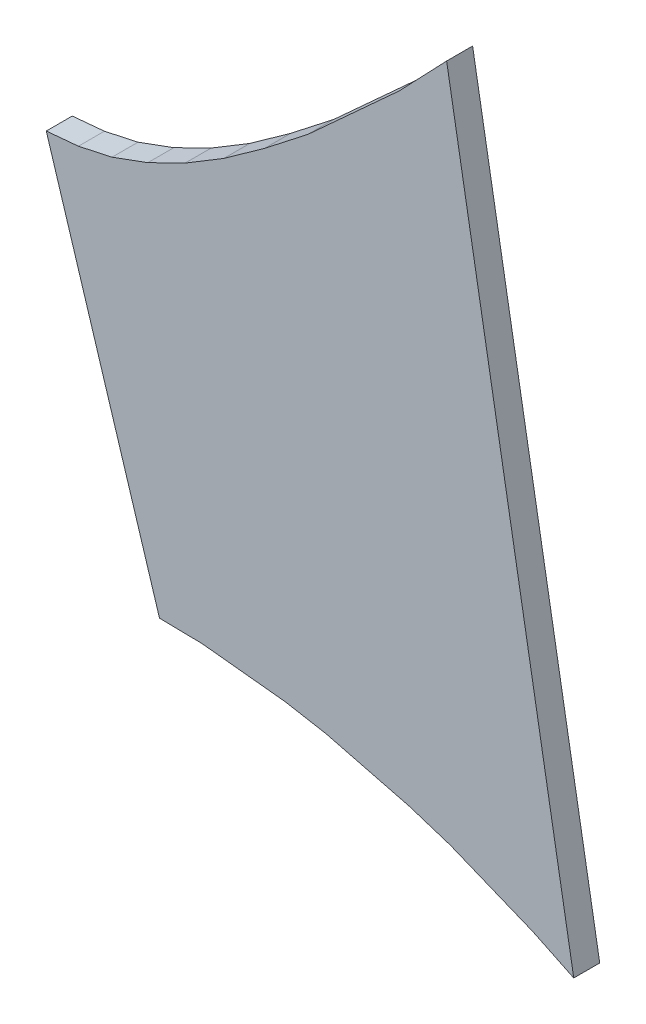
ISO-10303-21;
HEADER;
FILE_DESCRIPTION(('STEP AP214'),'2;1');
FILE_NAME('part.step','',(''),(''),'','','');
FILE_SCHEMA(('AUTOMOTIVE_DESIGN { 1 0 10303 214 1 1 1 1 }'));
ENDSEC;
DATA;
#1=APPLICATION_CONTEXT('core data for automotive mechanical design processes');
#2=APPLICATION_PROTOCOL_DEFINITION('international standard','automotive_design',2000,#1);
#3=PRODUCT_CONTEXT('',#1,'mechanical');
#4=PRODUCT('Part','Part','',(#3));
#5=PRODUCT_RELATED_PRODUCT_CATEGORY('part','',(#4));
#6=PRODUCT_DEFINITION_FORMATION('','',#4);
#7=PRODUCT_DEFINITION_CONTEXT('part definition',#1,'design');
#8=PRODUCT_DEFINITION('design','',#6,#7);
#9=PRODUCT_DEFINITION_SHAPE('','',#8);
#10=(LENGTH_UNIT() NAMED_UNIT(*) SI_UNIT(.MILLI.,.METRE.));
#11=(NAMED_UNIT(*) PLANE_ANGLE_UNIT() SI_UNIT($,.RADIAN.));
#12=(NAMED_UNIT(*) SI_UNIT($,.STERADIAN.) SOLID_ANGLE_UNIT());
#13=UNCERTAINTY_MEASURE_WITH_UNIT(LENGTH_MEASURE(1.E-05),#10,'distance_accuracy_value','');
#14=(GEOMETRIC_REPRESENTATION_CONTEXT(3) GLOBAL_UNCERTAINTY_ASSIGNED_CONTEXT((#13)) GLOBAL_UNIT_ASSIGNED_CONTEXT((#10,
#11,#12)) REPRESENTATION_CONTEXT('',''));
#15=CARTESIAN_POINT('',(0.,0.,0.));
#16=DIRECTION('',(0.,0.,1.));
#17=DIRECTION('',(1.,0.,0.));
#18=AXIS2_PLACEMENT_3D('',#15,#16,#17);
#19=CARTESIAN_POINT('',(61.5439987182617,104.078002929688,0.));
#20=DIRECTION('',(0.0172286164425987,0.99985157637295,0.));
#21=DIRECTION('',(0.99985157637295,-0.0172286164425987,0.));
#22=AXIS2_PLACEMENT_3D('',#19,#20,#21);
#23=PLANE('',#22);
#24=DIRECTION('',(0.99985157637295,-0.0172286164425987,0.));
#25=VECTOR('',#24,1.);
#26=CARTESIAN_POINT('',(61.5439987182617,104.078002929688,0.03556));
#27=LINE('',#26,#25);
#28=CARTESIAN_POINT('',(61.5439987182617,104.078002929688,0.03556));
#29=VERTEX_POINT('',#28);
#30=CARTESIAN_POINT('',(61.6020011901855,104.077003479004,0.03556));
#31=VERTEX_POINT('',#30);
#32=EDGE_CURVE('E11',#29,#31,#27,.T.);
#33=ORIENTED_EDGE('',*,*,#32,.F.);
#34=DIRECTION('',(0.,0.,1.));
#35=VECTOR('',#34,1.);
#36=CARTESIAN_POINT('',(61.5439987182617,104.078002929688,0.));
#37=LINE('',#36,#35);
#38=CARTESIAN_POINT('',(61.5439987182617,104.078002929688,0.));
#39=VERTEX_POINT('',#38);
#40=EDGE_CURVE('E24',#39,#29,#37,.T.);
#41=ORIENTED_EDGE('',*,*,#40,.F.);
#42=DIRECTION('',(0.99985157637295,-0.0172286164425987,0.));
#43=VECTOR('',#42,1.);
#44=CARTESIAN_POINT('',(61.5439987182617,104.078002929688,0.));
#45=LINE('',#44,#43);
#46=CARTESIAN_POINT('',(61.6020011901855,104.077003479004,0.));
#47=VERTEX_POINT('',#46);
#48=EDGE_CURVE('E160',#39,#47,#45,.T.);
#49=ORIENTED_EDGE('',*,*,#48,.T.);
#50=DIRECTION('',(0.,0.,1.));
#51=VECTOR('',#50,1.);
#52=CARTESIAN_POINT('',(61.6020011901855,104.077003479004,0.));
#53=LINE('',#52,#51);
#54=EDGE_CURVE('E37',#47,#31,#53,.T.);
#55=ORIENTED_EDGE('',*,*,#54,.T.);
#56=EDGE_LOOP('',(#33,#41,#49,#55));
#57=FACE_BOUND('',#56,.T.);
#58=ADVANCED_FACE('F17',(#57),#23,.F.);
#59=CARTESIAN_POINT('',(61.6020011901855,104.077003479004,0.));
#60=DIRECTION('',(0.104695178446212,0.994504358768787,0.));
#61=DIRECTION('',(0.994504358768787,-0.104695178446212,0.));
#62=AXIS2_PLACEMENT_3D('',#59,#60,#61);
#63=PLANE('',#62);
#64=DIRECTION('',(0.994504358768787,-0.104695178446212,0.));
#65=VECTOR('',#64,1.);
#66=CARTESIAN_POINT('',(61.6020011901855,104.077003479004,0.03556));
#67=LINE('',#66,#65);
#68=CARTESIAN_POINT('',(61.7159996032715,104.065002441406,0.03556));
#69=VERTEX_POINT('',#68);
#70=EDGE_CURVE('E280',#31,#69,#67,.T.);
#71=ORIENTED_EDGE('',*,*,#70,.F.);
#72=ORIENTED_EDGE('',*,*,#54,.F.);
#73=DIRECTION('',(0.994504358768787,-0.104695178446212,0.));
#74=VECTOR('',#73,1.);
#75=CARTESIAN_POINT('',(61.6020011901855,104.077003479004,0.));
#76=LINE('',#75,#74);
#77=CARTESIAN_POINT('',(61.7159996032715,104.065002441406,0.));
#78=VERTEX_POINT('',#77);
#79=EDGE_CURVE('E277',#47,#78,#76,.T.);
#80=ORIENTED_EDGE('',*,*,#79,.T.);
#81=DIRECTION('',(0.,0.,1.));
#82=VECTOR('',#81,1.);
#83=CARTESIAN_POINT('',(61.7159996032715,104.065002441406,0.));
#84=LINE('',#83,#82);
#85=EDGE_CURVE('E275',#78,#69,#84,.T.);
#86=ORIENTED_EDGE('',*,*,#85,.T.);
#87=EDGE_LOOP('',(#71,#72,#80,#86));
#88=FACE_BOUND('',#87,.T.);
#89=ADVANCED_FACE('F288',(#88),#63,.F.);
#90=CARTESIAN_POINT('',(61.7159996032715,104.065002441406,0.));
#91=DIRECTION('',(0.175827773431546,0.984420943545039,0.));
#92=DIRECTION('',(0.984420943545039,-0.175827773431546,0.));
#93=AXIS2_PLACEMENT_3D('',#90,#91,#92);
#94=PLANE('',#93);
#95=DIRECTION('',(0.984420943545039,-0.175827773431546,0.));
#96=VECTOR('',#95,1.);
#97=CARTESIAN_POINT('',(61.7159996032715,104.065002441406,0.03556));
#98=LINE('',#97,#96);
#99=CARTESIAN_POINT('',(61.7719993591309,104.055000305176,0.03556));
#100=VERTEX_POINT('',#99);
#101=EDGE_CURVE('E272',#69,#100,#98,.T.);
#102=ORIENTED_EDGE('',*,*,#101,.F.);
#103=ORIENTED_EDGE('',*,*,#85,.F.);
#104=DIRECTION('',(0.984420943545039,-0.175827773431546,0.));
#105=VECTOR('',#104,1.);
#106=CARTESIAN_POINT('',(61.7159996032715,104.065002441406,0.));
#107=LINE('',#106,#105);
#108=CARTESIAN_POINT('',(61.7719993591309,104.055000305176,0.));
#109=VERTEX_POINT('',#108);
#110=EDGE_CURVE('E269',#78,#109,#107,.T.);
#111=ORIENTED_EDGE('',*,*,#110,.T.);
#112=DIRECTION('',(0.,0.,1.));
#113=VECTOR('',#112,1.);
#114=CARTESIAN_POINT('',(61.7719993591309,104.055000305176,0.));
#115=LINE('',#114,#113);
#116=EDGE_CURVE('E267',#109,#100,#115,.T.);
#117=ORIENTED_EDGE('',*,*,#116,.T.);
#118=EDGE_LOOP('',(#102,#103,#111,#117));
#119=FACE_BOUND('',#118,.T.);
#120=ADVANCED_FACE('F294',(#119),#94,.F.);
#121=CARTESIAN_POINT('',(61.7719993591309,104.055000305176,0.));
#122=DIRECTION('',(0.246524231057554,0.969136627881478,0.));
#123=DIRECTION('',(0.969136627881478,-0.246524231057554,0.));
#124=AXIS2_PLACEMENT_3D('',#121,#122,#123);
#125=PLANE('',#124);
#126=DIRECTION('',(0.969136627881478,-0.246524231057554,0.));
#127=VECTOR('',#126,1.);
#128=CARTESIAN_POINT('',(61.7719993591309,104.055000305176,0.03556));
#129=LINE('',#128,#127);
#130=CARTESIAN_POINT('',(61.8860015869141,104.026000976562,0.03556));
#131=VERTEX_POINT('',#130);
#132=EDGE_CURVE('E264',#100,#131,#129,.T.);
#133=ORIENTED_EDGE('',*,*,#132,.F.);
#134=ORIENTED_EDGE('',*,*,#116,.F.);
#135=DIRECTION('',(0.969136627881478,-0.246524231057554,0.));
#136=VECTOR('',#135,1.);
#137=CARTESIAN_POINT('',(61.7719993591309,104.055000305176,0.));
#138=LINE('',#137,#136);
#139=CARTESIAN_POINT('',(61.8860015869141,104.026000976562,0.));
#140=VERTEX_POINT('',#139);
#141=EDGE_CURVE('E261',#109,#140,#138,.T.);
#142=ORIENTED_EDGE('',*,*,#141,.T.);
#143=DIRECTION('',(0.,0.,1.));
#144=VECTOR('',#143,1.);
#145=CARTESIAN_POINT('',(61.8860015869141,104.026000976562,0.));
#146=LINE('',#145,#144);
#147=EDGE_CURVE('E259',#140,#131,#146,.T.);
#148=ORIENTED_EDGE('',*,*,#147,.T.);
#149=EDGE_LOOP('',(#133,#134,#142,#148));
#150=FACE_BOUND('',#149,.T.);
#151=ADVANCED_FACE('F296',(#150),#125,.F.);
#152=CARTESIAN_POINT('',(61.8860015869141,104.026000976562,0.));
#153=DIRECTION('',(0.305975591711546,0.952039356999893,0.));
#154=DIRECTION('',(0.952039356999893,-0.305975591711546,0.));
#155=AXIS2_PLACEMENT_3D('',#152,#153,#154);
#156=PLANE('',#155);
#157=DIRECTION('',(0.952039356999893,-0.305975591711546,0.));
#158=VECTOR('',#157,1.);
#159=CARTESIAN_POINT('',(61.8860015869141,104.026000976562,0.03556));
#160=LINE('',#159,#158);
#161=CARTESIAN_POINT('',(61.9420013427734,104.008003234863,0.03556));
#162=VERTEX_POINT('',#161);
#163=EDGE_CURVE('E256',#131,#162,#160,.T.);
#164=ORIENTED_EDGE('',*,*,#163,.F.);
#165=ORIENTED_EDGE('',*,*,#147,.F.);
#166=DIRECTION('',(0.952039356999893,-0.305975591711546,0.));
#167=VECTOR('',#166,1.);
#168=CARTESIAN_POINT('',(61.8860015869141,104.026000976562,0.));
#169=LINE('',#168,#167);
#170=CARTESIAN_POINT('',(61.9420013427734,104.008003234863,0.));
#171=VERTEX_POINT('',#170);
#172=EDGE_CURVE('E253',#140,#171,#169,.T.);
#173=ORIENTED_EDGE('',*,*,#172,.T.);
#174=DIRECTION('',(0.,0.,1.));
#175=VECTOR('',#174,1.);
#176=CARTESIAN_POINT('',(61.9420013427734,104.008003234863,0.));
#177=LINE('',#176,#175);
#178=EDGE_CURVE('E251',#171,#162,#177,.T.);
#179=ORIENTED_EDGE('',*,*,#178,.T.);
#180=EDGE_LOOP('',(#164,#165,#173,#179));
#181=FACE_BOUND('',#180,.T.);
#182=ADVANCED_FACE('F301',(#181),#156,.F.);
#183=CARTESIAN_POINT('',(61.9420013427734,104.008003234863,0.));
#184=DIRECTION('',(0.377076391215179,0.926182160910119,0.));
#185=DIRECTION('',(0.926182160910119,-0.377076391215179,0.));
#186=AXIS2_PLACEMENT_3D('',#183,#184,#185);
#187=PLANE('',#186);
#188=DIRECTION('',(0.926182160910119,-0.377076391215179,0.));
#189=VECTOR('',#188,1.);
#190=CARTESIAN_POINT('',(61.9420013427734,104.008003234863,0.03556));
#191=LINE('',#190,#189);
#192=CARTESIAN_POINT('',(62.0550003051758,103.96199798584,0.03556));
#193=VERTEX_POINT('',#192);
#194=EDGE_CURVE('E248',#162,#193,#191,.T.);
#195=ORIENTED_EDGE('',*,*,#194,.F.);
#196=ORIENTED_EDGE('',*,*,#178,.F.);
#197=DIRECTION('',(0.926182160910119,-0.377076391215179,0.));
#198=VECTOR('',#197,1.);
#199=CARTESIAN_POINT('',(61.9420013427734,104.008003234863,0.));
#200=LINE('',#199,#198);
#201=CARTESIAN_POINT('',(62.0550003051758,103.96199798584,0.));
#202=VERTEX_POINT('',#201);
#203=EDGE_CURVE('E245',#171,#202,#200,.T.);
#204=ORIENTED_EDGE('',*,*,#203,.T.);
#205=DIRECTION('',(0.,0.,1.));
#206=VECTOR('',#205,1.);
#207=CARTESIAN_POINT('',(62.0550003051758,103.96199798584,0.));
#208=LINE('',#207,#206);
#209=EDGE_CURVE('E243',#202,#193,#208,.T.);
#210=ORIENTED_EDGE('',*,*,#209,.T.);
#211=EDGE_LOOP('',(#195,#196,#204,#210));
#212=FACE_BOUND('',#211,.T.);
#213=ADVANCED_FACE('F304',(#212),#187,.F.);
#214=CARTESIAN_POINT('',(62.0550003051758,103.96199798584,0.));
#215=DIRECTION('',(0.43430629801226,0.90076525216445,0.));
#216=DIRECTION('',(0.90076525216445,-0.43430629801226,0.));
#217=AXIS2_PLACEMENT_3D('',#214,#215,#216);
#218=PLANE('',#217);
#219=DIRECTION('',(0.90076525216445,-0.43430629801226,0.));
#220=VECTOR('',#219,1.);
#221=CARTESIAN_POINT('',(62.0550003051758,103.96199798584,0.03556));
#222=LINE('',#221,#220);
#223=CARTESIAN_POINT('',(62.1110000610352,103.934997558594,0.03556));
#224=VERTEX_POINT('',#223);
#225=EDGE_CURVE('E240',#193,#224,#222,.T.);
#226=ORIENTED_EDGE('',*,*,#225,.F.);
#227=ORIENTED_EDGE('',*,*,#209,.F.);
#228=DIRECTION('',(0.90076525216445,-0.43430629801226,0.));
#229=VECTOR('',#228,1.);
#230=CARTESIAN_POINT('',(62.0550003051758,103.96199798584,0.));
#231=LINE('',#230,#229);
#232=CARTESIAN_POINT('',(62.1110000610352,103.934997558594,0.));
#233=VERTEX_POINT('',#232);
#234=EDGE_CURVE('E237',#202,#233,#231,.T.);
#235=ORIENTED_EDGE('',*,*,#234,.T.);
#236=DIRECTION('',(0.,0.,1.));
#237=VECTOR('',#236,1.);
#238=CARTESIAN_POINT('',(62.1110000610352,103.934997558594,0.));
#239=LINE('',#238,#237);
#240=EDGE_CURVE('E235',#233,#224,#239,.T.);
#241=ORIENTED_EDGE('',*,*,#240,.T.);
#242=EDGE_LOOP('',(#226,#227,#235,#241));
#243=FACE_BOUND('',#242,.T.);
#244=ADVANCED_FACE('F309',(#243),#218,.F.);
#245=CARTESIAN_POINT('',(62.1110000610352,103.934997558594,0.));
#246=DIRECTION('',(-0.985197325242907,-0.171424124131411,0.));
#247=DIRECTION('',(-0.171424124131411,0.985197325242907,0.));
#248=AXIS2_PLACEMENT_3D('',#245,#246,#247);
#249=PLANE('',#248);
#250=DIRECTION('',(-0.171424124131411,0.985197325242907,0.));
#251=VECTOR('',#250,1.);
#252=CARTESIAN_POINT('',(62.1110000610352,103.934997558594,0.03556));
#253=LINE('',#252,#251);
#254=CARTESIAN_POINT('',(61.9370002746582,104.934997558594,0.03556));
#255=VERTEX_POINT('',#254);
#256=EDGE_CURVE('E232',#224,#255,#253,.T.);
#257=ORIENTED_EDGE('',*,*,#256,.F.);
#258=ORIENTED_EDGE('',*,*,#240,.F.);
#259=DIRECTION('',(-0.171424124131411,0.985197325242907,0.));
#260=VECTOR('',#259,1.);
#261=CARTESIAN_POINT('',(62.1110000610352,103.934997558594,0.));
#262=LINE('',#261,#260);
#263=CARTESIAN_POINT('',(61.9370002746582,104.934997558594,0.));
#264=VERTEX_POINT('',#263);
#265=EDGE_CURVE('E229',#233,#264,#262,.T.);
#266=ORIENTED_EDGE('',*,*,#265,.T.);
#267=DIRECTION('',(0.,0.,1.));
#268=VECTOR('',#267,1.);
#269=CARTESIAN_POINT('',(61.9370002746582,104.934997558594,0.));
#270=LINE('',#269,#268);
#271=EDGE_CURVE('E227',#264,#255,#270,.T.);
#272=ORIENTED_EDGE('',*,*,#271,.T.);
#273=EDGE_LOOP('',(#257,#258,#266,#272));
#274=FACE_BOUND('',#273,.T.);
#275=ADVANCED_FACE('F312',(#274),#249,.F.);
#276=CARTESIAN_POINT('',(61.9370002746582,104.934997558594,0.));
#277=DIRECTION('',(0.72288400526252,-0.69096940231505,0.));
#278=DIRECTION('',(-0.69096940231505,-0.72288400526252,0.));
#279=AXIS2_PLACEMENT_3D('',#276,#277,#278);
#280=PLANE('',#279);
#281=DIRECTION('',(-0.69096940231505,-0.72288400526252,0.));
#282=VECTOR('',#281,1.);
#283=CARTESIAN_POINT('',(61.9370002746582,104.934997558594,0.03556));
#284=LINE('',#283,#282);
#285=CARTESIAN_POINT('',(61.8720016479492,104.866996765137,0.03556));
#286=VERTEX_POINT('',#285);
#287=EDGE_CURVE('E224',#255,#286,#284,.T.);
#288=ORIENTED_EDGE('',*,*,#287,.F.);
#289=ORIENTED_EDGE('',*,*,#271,.F.);
#290=DIRECTION('',(-0.69096940231505,-0.72288400526252,0.));
#291=VECTOR('',#290,1.);
#292=CARTESIAN_POINT('',(61.9370002746582,104.934997558594,0.));
#293=LINE('',#292,#291);
#294=CARTESIAN_POINT('',(61.8720016479492,104.866996765137,0.));
#295=VERTEX_POINT('',#294);
#296=EDGE_CURVE('E221',#264,#295,#293,.T.);
#297=ORIENTED_EDGE('',*,*,#296,.T.);
#298=DIRECTION('',(0.,0.,1.));
#299=VECTOR('',#298,1.);
#300=CARTESIAN_POINT('',(61.8720016479492,104.866996765137,0.));
#301=LINE('',#300,#299);
#302=EDGE_CURVE('E219',#295,#286,#301,.T.);
#303=ORIENTED_EDGE('',*,*,#302,.T.);
#304=EDGE_LOOP('',(#288,#289,#297,#303));
#305=FACE_BOUND('',#304,.T.);
#306=ADVANCED_FACE('F317',(#305),#280,.F.);
#307=CARTESIAN_POINT('',(61.8720016479492,104.866996765137,0.));
#308=DIRECTION('',(0.673843663839614,-0.738873951836986,0.));
#309=DIRECTION('',(-0.738873951836986,-0.673843663839614,0.));
#310=AXIS2_PLACEMENT_3D('',#307,#308,#309);
#311=PLANE('',#310);
#312=DIRECTION('',(-0.738873951836986,-0.673843663839614,0.));
#313=VECTOR('',#312,1.);
#314=CARTESIAN_POINT('',(61.8720016479492,104.866996765137,0.03556));
#315=LINE('',#314,#313);
#316=CARTESIAN_POINT('',(61.7470016479492,104.752998352051,0.03556));
#317=VERTEX_POINT('',#316);
#318=EDGE_CURVE('E216',#286,#317,#315,.T.);
#319=ORIENTED_EDGE('',*,*,#318,.F.);
#320=ORIENTED_EDGE('',*,*,#302,.F.);
#321=DIRECTION('',(-0.738873951836986,-0.673843663839614,0.));
#322=VECTOR('',#321,1.);
#323=CARTESIAN_POINT('',(61.8720016479492,104.866996765137,0.));
#324=LINE('',#323,#322);
#325=CARTESIAN_POINT('',(61.7470016479492,104.752998352051,0.));
#326=VERTEX_POINT('',#325);
#327=EDGE_CURVE('E213',#295,#326,#324,.T.);
#328=ORIENTED_EDGE('',*,*,#327,.T.);
#329=DIRECTION('',(0.,0.,1.));
#330=VECTOR('',#329,1.);
#331=CARTESIAN_POINT('',(61.7470016479492,104.752998352051,0.));
#332=LINE('',#331,#330);
#333=EDGE_CURVE('E211',#326,#317,#332,.T.);
#334=ORIENTED_EDGE('',*,*,#333,.T.);
#335=EDGE_LOOP('',(#319,#320,#328,#334));
#336=FACE_BOUND('',#335,.T.);
#337=ADVANCED_FACE('F320',(#336),#311,.F.);
#338=CARTESIAN_POINT('',(61.7470016479492,104.752998352051,0.));
#339=DIRECTION('',(0.614833324057586,-0.788657076065573,0.));
#340=DIRECTION('',(-0.788657076065573,-0.614833324057586,0.));
#341=AXIS2_PLACEMENT_3D('',#338,#339,#340);
#342=PLANE('',#341);
#343=DIRECTION('',(-0.788657076065573,-0.614833324057586,0.));
#344=VECTOR('',#343,1.);
#345=CARTESIAN_POINT('',(61.7470016479492,104.752998352051,0.03556));
#346=LINE('',#345,#344);
#347=CARTESIAN_POINT('',(61.6879997253418,104.707000732422,0.03556));
#348=VERTEX_POINT('',#347);
#349=EDGE_CURVE('E208',#317,#348,#346,.T.);
#350=ORIENTED_EDGE('',*,*,#349,.F.);
#351=ORIENTED_EDGE('',*,*,#333,.F.);
#352=DIRECTION('',(-0.788657076065573,-0.614833324057586,0.));
#353=VECTOR('',#352,1.);
#354=CARTESIAN_POINT('',(61.7470016479492,104.752998352051,0.));
#355=LINE('',#354,#353);
#356=CARTESIAN_POINT('',(61.6879997253418,104.707000732422,0.));
#357=VERTEX_POINT('',#356);
#358=EDGE_CURVE('E205',#326,#357,#355,.T.);
#359=ORIENTED_EDGE('',*,*,#358,.T.);
#360=DIRECTION('',(0.,0.,1.));
#361=VECTOR('',#360,1.);
#362=CARTESIAN_POINT('',(61.6879997253418,104.707000732422,0.));
#363=LINE('',#362,#361);
#364=EDGE_CURVE('E203',#357,#348,#363,.T.);
#365=ORIENTED_EDGE('',*,*,#364,.T.);
#366=EDGE_LOOP('',(#350,#351,#359,#365));
#367=FACE_BOUND('',#366,.T.);
#368=ADVANCED_FACE('F325',(#367),#342,.F.);
#369=CARTESIAN_POINT('',(61.6879997253418,104.707000732422,0.));
#370=DIRECTION('',(0.581248680602604,-0.813725980473606,0.));
#371=DIRECTION('',(-0.813725980473606,-0.581248680602604,0.));
#372=AXIS2_PLACEMENT_3D('',#369,#370,#371);
#373=PLANE('',#372);
#374=DIRECTION('',(-0.813725980473606,-0.581248680602604,0.));
#375=VECTOR('',#374,1.);
#376=CARTESIAN_POINT('',(61.6879997253418,104.707000732422,0.03556));
#377=LINE('',#376,#375);
#378=CARTESIAN_POINT('',(61.6319999694824,104.666999816894,0.03556));
#379=VERTEX_POINT('',#378);
#380=EDGE_CURVE('E200',#348,#379,#377,.T.);
#381=ORIENTED_EDGE('',*,*,#380,.F.);
#382=ORIENTED_EDGE('',*,*,#364,.F.);
#383=DIRECTION('',(-0.813725980473606,-0.581248680602604,0.));
#384=VECTOR('',#383,1.);
#385=CARTESIAN_POINT('',(61.6879997253418,104.707000732422,0.));
#386=LINE('',#385,#384);
#387=CARTESIAN_POINT('',(61.6319999694824,104.666999816894,0.));
#388=VERTEX_POINT('',#387);
#389=EDGE_CURVE('E197',#357,#388,#386,.T.);
#390=ORIENTED_EDGE('',*,*,#389,.T.);
#391=DIRECTION('',(0.,0.,1.));
#392=VECTOR('',#391,1.);
#393=CARTESIAN_POINT('',(61.6319999694824,104.666999816894,0.));
#394=LINE('',#393,#392);
#395=EDGE_CURVE('E195',#388,#379,#394,.T.);
#396=ORIENTED_EDGE('',*,*,#395,.T.);
#397=EDGE_LOOP('',(#381,#382,#390,#396));
#398=FACE_BOUND('',#397,.T.);
#399=ADVANCED_FACE('F328',(#398),#373,.F.);
#400=CARTESIAN_POINT('',(61.6319999694824,104.666999816894,0.));
#401=DIRECTION('',(0.516831611565296,-0.856087078098262,0.));
#402=DIRECTION('',(-0.856087078098262,-0.516831611565296,0.));
#403=AXIS2_PLACEMENT_3D('',#400,#401,#402);
#404=PLANE('',#403);
#405=DIRECTION('',(-0.856087078098262,-0.516831611565296,0.));
#406=VECTOR('',#405,1.);
#407=CARTESIAN_POINT('',(61.6319999694824,104.666999816894,0.03556));
#408=LINE('',#407,#406);
#409=CARTESIAN_POINT('',(61.5789985656738,104.63500213623,0.03556));
#410=VERTEX_POINT('',#409);
#411=EDGE_CURVE('E192',#379,#410,#408,.T.);
#412=ORIENTED_EDGE('',*,*,#411,.F.);
#413=ORIENTED_EDGE('',*,*,#395,.F.);
#414=DIRECTION('',(-0.856087078098262,-0.516831611565296,0.));
#415=VECTOR('',#414,1.);
#416=CARTESIAN_POINT('',(61.6319999694824,104.666999816894,0.));
#417=LINE('',#416,#415);
#418=CARTESIAN_POINT('',(61.5789985656738,104.63500213623,0.));
#419=VERTEX_POINT('',#418);
#420=EDGE_CURVE('E189',#388,#419,#417,.T.);
#421=ORIENTED_EDGE('',*,*,#420,.T.);
#422=DIRECTION('',(0.,0.,1.));
#423=VECTOR('',#422,1.);
#424=CARTESIAN_POINT('',(61.5789985656738,104.63500213623,0.));
#425=LINE('',#424,#423);
#426=EDGE_CURVE('E187',#419,#410,#425,.T.);
#427=ORIENTED_EDGE('',*,*,#426,.T.);
#428=EDGE_LOOP('',(#412,#413,#421,#427));
#429=FACE_BOUND('',#428,.T.);
#430=ADVANCED_FACE('F333',(#429),#404,.F.);
#431=CARTESIAN_POINT('',(61.5789985656738,104.63500213623,0.));
#432=DIRECTION('',(0.440188008599971,-0.897905628161887,0.));
#433=DIRECTION('',(-0.897905628161887,-0.440188008599971,0.));
#434=AXIS2_PLACEMENT_3D('',#431,#432,#433);
#435=PLANE('',#434);
#436=DIRECTION('',(-0.897905628161887,-0.440188008599971,0.));
#437=VECTOR('',#436,1.);
#438=CARTESIAN_POINT('',(61.5789985656738,104.63500213623,0.03556));
#439=LINE('',#438,#437);
#440=CARTESIAN_POINT('',(61.5279998779297,104.610000610352,0.03556));
#441=VERTEX_POINT('',#440);
#442=EDGE_CURVE('E184',#410,#441,#439,.T.);
#443=ORIENTED_EDGE('',*,*,#442,.F.);
#444=ORIENTED_EDGE('',*,*,#426,.F.);
#445=DIRECTION('',(-0.897905628161887,-0.440188008599971,0.));
#446=VECTOR('',#445,1.);
#447=CARTESIAN_POINT('',(61.5789985656738,104.63500213623,0.));
#448=LINE('',#447,#446);
#449=CARTESIAN_POINT('',(61.5279998779297,104.610000610352,0.));
#450=VERTEX_POINT('',#449);
#451=EDGE_CURVE('E181',#419,#450,#448,.T.);
#452=ORIENTED_EDGE('',*,*,#451,.T.);
#453=DIRECTION('',(0.,0.,1.));
#454=VECTOR('',#453,1.);
#455=CARTESIAN_POINT('',(61.5279998779297,104.610000610352,0.));
#456=LINE('',#455,#454);
#457=EDGE_CURVE('E179',#450,#441,#456,.T.);
#458=ORIENTED_EDGE('',*,*,#457,.T.);
#459=EDGE_LOOP('',(#443,#444,#452,#458));
#460=FACE_BOUND('',#459,.T.);
#461=ADVANCED_FACE('F336',(#460),#435,.F.);
#462=CARTESIAN_POINT('',(61.5279998779297,104.610000610352,0.));
#463=DIRECTION('',(0.344780668789865,-0.938683274821073,0.));
#464=DIRECTION('',(-0.938683274821073,-0.344780668789865,0.));
#465=AXIS2_PLACEMENT_3D('',#462,#463,#464);
#466=PLANE('',#465);
#467=DIRECTION('',(-0.938683274821072,-0.344780668789865,0.));
#468=VECTOR('',#467,1.);
#469=CARTESIAN_POINT('',(61.5279998779297,104.610000610352,0.03556));
#470=LINE('',#469,#468);
#471=CARTESIAN_POINT('',(61.4790000915527,104.592002868652,0.03556));
#472=VERTEX_POINT('',#471);
#473=EDGE_CURVE('E176',#441,#472,#470,.T.);
#474=ORIENTED_EDGE('',*,*,#473,.F.);
#475=ORIENTED_EDGE('',*,*,#457,.F.);
#476=DIRECTION('',(-0.938683274821072,-0.344780668789865,0.));
#477=VECTOR('',#476,1.);
#478=CARTESIAN_POINT('',(61.5279998779297,104.610000610352,0.));
#479=LINE('',#478,#477);
#480=CARTESIAN_POINT('',(61.4790000915527,104.592002868652,0.));
#481=VERTEX_POINT('',#480);
#482=EDGE_CURVE('E173',#450,#481,#479,.T.);
#483=ORIENTED_EDGE('',*,*,#482,.T.);
#484=DIRECTION('',(0.,0.,1.));
#485=VECTOR('',#484,1.);
#486=CARTESIAN_POINT('',(61.4790000915527,104.592002868652,0.));
#487=LINE('',#486,#485);
#488=EDGE_CURVE('E171',#481,#472,#487,.T.);
#489=ORIENTED_EDGE('',*,*,#488,.T.);
#490=EDGE_LOOP('',(#474,#475,#483,#489));
#491=FACE_BOUND('',#490,.T.);
#492=ADVANCED_FACE('F341',(#491),#466,.F.);
#493=CARTESIAN_POINT('',(61.4790000915527,104.592002868652,0.));
#494=DIRECTION('',(0.212466649897079,-0.977168318500714,0.));
#495=DIRECTION('',(-0.977168318500714,-0.212466649897079,0.));
#496=AXIS2_PLACEMENT_3D('',#493,#494,#495);
#497=PLANE('',#496);
#498=DIRECTION('',(-0.977168318500714,-0.212466649897079,0.));
#499=VECTOR('',#498,1.);
#500=CARTESIAN_POINT('',(61.4790000915527,104.592002868652,0.03556));
#501=LINE('',#500,#499);
#502=CARTESIAN_POINT('',(61.4329986572266,104.582000732422,0.03556));
#503=VERTEX_POINT('',#502);
#504=EDGE_CURVE('E168',#472,#503,#501,.T.);
#505=ORIENTED_EDGE('',*,*,#504,.F.);
#506=ORIENTED_EDGE('',*,*,#488,.F.);
#507=DIRECTION('',(-0.977168318500714,-0.212466649897079,0.));
#508=VECTOR('',#507,1.);
#509=CARTESIAN_POINT('',(61.4790000915527,104.592002868652,0.));
#510=LINE('',#509,#508);
#511=CARTESIAN_POINT('',(61.4329986572266,104.582000732422,0.));
#512=VERTEX_POINT('',#511);
#513=EDGE_CURVE('E166',#481,#512,#510,.T.);
#514=ORIENTED_EDGE('',*,*,#513,.T.);
#515=DIRECTION('',(0.,0.,1.));
#516=VECTOR('',#515,1.);
#517=CARTESIAN_POINT('',(61.4329986572266,104.582000732422,0.));
#518=LINE('',#517,#516);
#519=EDGE_CURVE('E151',#512,#503,#518,.T.);
#520=ORIENTED_EDGE('',*,*,#519,.T.);
#521=EDGE_LOOP('',(#505,#506,#514,#520));
#522=FACE_BOUND('',#521,.T.);
#523=ADVANCED_FACE('F343',(#522),#497,.F.);
#524=CARTESIAN_POINT('',(61.4329986572266,104.582000732422,0.));
#525=DIRECTION('',(0.0904890349844395,-0.99589745182302,0.));
#526=DIRECTION('',(-0.99589745182302,-0.0904890349844395,0.));
#527=AXIS2_PLACEMENT_3D('',#524,#525,#526);
#528=PLANE('',#527);
#529=DIRECTION('',(-0.99589745182302,-0.0904890349844395,0.));
#530=VECTOR('',#529,1.);
#531=CARTESIAN_POINT('',(61.4329986572266,104.582000732422,0.03556));
#532=LINE('',#531,#530);
#533=CARTESIAN_POINT('',(61.3889999389648,104.578002929688,0.03556));
#534=VERTEX_POINT('',#533);
#535=EDGE_CURVE('E155',#503,#534,#532,.T.);
#536=ORIENTED_EDGE('',*,*,#535,.F.);
#537=ORIENTED_EDGE('',*,*,#519,.F.);
#538=DIRECTION('',(-0.99589745182302,-0.0904890349844395,0.));
#539=VECTOR('',#538,1.);
#540=CARTESIAN_POINT('',(61.4329986572266,104.582000732422,0.));
#541=LINE('',#540,#539);
#542=CARTESIAN_POINT('',(61.3889999389648,104.578002929688,0.));
#543=VERTEX_POINT('',#542);
#544=EDGE_CURVE('E147',#512,#543,#541,.T.);
#545=ORIENTED_EDGE('',*,*,#544,.T.);
#546=DIRECTION('',(0.,0.,1.));
#547=VECTOR('',#546,1.);
#548=CARTESIAN_POINT('',(61.3889999389648,104.578002929688,0.));
#549=LINE('',#548,#547);
#550=EDGE_CURVE('E137',#543,#534,#549,.T.);
#551=ORIENTED_EDGE('',*,*,#550,.T.);
#552=EDGE_LOOP('',(#536,#537,#545,#551));
#553=FACE_BOUND('',#552,.T.);
#554=ADVANCED_FACE('F150',(#553),#528,.F.);
#555=CARTESIAN_POINT('',(61.3889999389648,104.578002929688,0.));
#556=DIRECTION('',(0.955157985690276,0.29609664363531,0.));
#557=DIRECTION('',(0.29609664363531,-0.955157985690276,0.));
#558=AXIS2_PLACEMENT_3D('',#555,#556,#557);
#559=PLANE('',#558);
#560=DIRECTION('',(0.296096643635309,-0.955157985690275,0.));
#561=VECTOR('',#560,1.);
#562=CARTESIAN_POINT('',(61.3889999389648,104.578002929688,0.03556));
#563=LINE('',#562,#561);
#564=EDGE_CURVE('E143',#534,#29,#563,.T.);
#565=ORIENTED_EDGE('',*,*,#564,.F.);
#566=ORIENTED_EDGE('',*,*,#550,.F.);
#567=DIRECTION('',(0.296096643635309,-0.955157985690275,0.));
#568=VECTOR('',#567,1.);
#569=CARTESIAN_POINT('',(61.3889999389648,104.578002929688,0.));
#570=LINE('',#569,#568);
#571=EDGE_CURVE('E141',#543,#39,#570,.T.);
#572=ORIENTED_EDGE('',*,*,#571,.T.);
#573=ORIENTED_EDGE('',*,*,#40,.T.);
#574=EDGE_LOOP('',(#565,#566,#572,#573));
#575=FACE_BOUND('',#574,.T.);
#576=ADVANCED_FACE('F139',(#575),#559,.F.);
#577=CARTESIAN_POINT('',(61.5439987182617,104.078002929688,0.));
#578=DIRECTION('',(0.,0.,1.));
#579=DIRECTION('',(1.,0.,0.));
#580=AXIS2_PLACEMENT_3D('',#577,#578,#579);
#581=PLANE('',#580);
#582=ORIENTED_EDGE('',*,*,#571,.F.);
#583=ORIENTED_EDGE('',*,*,#544,.F.);
#584=ORIENTED_EDGE('',*,*,#513,.F.);
#585=ORIENTED_EDGE('',*,*,#482,.F.);
#586=ORIENTED_EDGE('',*,*,#451,.F.);
#587=ORIENTED_EDGE('',*,*,#420,.F.);
#588=ORIENTED_EDGE('',*,*,#389,.F.);
#589=ORIENTED_EDGE('',*,*,#358,.F.);
#590=ORIENTED_EDGE('',*,*,#327,.F.);
#591=ORIENTED_EDGE('',*,*,#296,.F.);
#592=ORIENTED_EDGE('',*,*,#265,.F.);
#593=ORIENTED_EDGE('',*,*,#234,.F.);
#594=ORIENTED_EDGE('',*,*,#203,.F.);
#595=ORIENTED_EDGE('',*,*,#172,.F.);
#596=ORIENTED_EDGE('',*,*,#141,.F.);
#597=ORIENTED_EDGE('',*,*,#110,.F.);
#598=ORIENTED_EDGE('',*,*,#79,.F.);
#599=ORIENTED_EDGE('',*,*,#48,.F.);
#600=EDGE_LOOP('',(#582,#583,#584,#585,#586,#587,#588,#589,#590,#591,#592,#593,#594,#595,#596,
#597,#598,#599));
#601=FACE_BOUND('',#600,.T.);
#602=ADVANCED_FACE('F158',(#601),#581,.F.);
#603=CARTESIAN_POINT('',(61.5439987182617,104.078002929688,0.03556));
#604=DIRECTION('',(0.,0.,1.));
#605=DIRECTION('',(1.,0.,0.));
#606=AXIS2_PLACEMENT_3D('',#603,#604,#605);
#607=PLANE('',#606);
#608=ORIENTED_EDGE('',*,*,#32,.T.);
#609=ORIENTED_EDGE('',*,*,#70,.T.);
#610=ORIENTED_EDGE('',*,*,#101,.T.);
#611=ORIENTED_EDGE('',*,*,#132,.T.);
#612=ORIENTED_EDGE('',*,*,#163,.T.);
#613=ORIENTED_EDGE('',*,*,#194,.T.);
#614=ORIENTED_EDGE('',*,*,#225,.T.);
#615=ORIENTED_EDGE('',*,*,#256,.T.);
#616=ORIENTED_EDGE('',*,*,#287,.T.);
#617=ORIENTED_EDGE('',*,*,#318,.T.);
#618=ORIENTED_EDGE('',*,*,#349,.T.);
#619=ORIENTED_EDGE('',*,*,#380,.T.);
#620=ORIENTED_EDGE('',*,*,#411,.T.);
#621=ORIENTED_EDGE('',*,*,#442,.T.);
#622=ORIENTED_EDGE('',*,*,#473,.T.);
#623=ORIENTED_EDGE('',*,*,#504,.T.);
#624=ORIENTED_EDGE('',*,*,#535,.T.);
#625=ORIENTED_EDGE('',*,*,#564,.T.);
#626=EDGE_LOOP('',(#608,#609,#610,#611,#612,#613,#614,#615,#616,#617,#618,#619,#620,#621,#622,
#623,#624,#625));
#627=FACE_BOUND('',#626,.T.);
#628=ADVANCED_FACE('F291',(#627),#607,.T.);
#629=CLOSED_SHELL('',(#58,#89,#120,#151,#182,#213,#244,#275,#306,#337,#368,#399,#430,#461,#492,
#523,#554,#576,#602,#628));
#630=MANIFOLD_SOLID_BREP('B1',#629);
#631=ADVANCED_BREP_SHAPE_REPRESENTATION('',(#18,#630),#14);
#632=SHAPE_DEFINITION_REPRESENTATION(#9,#631);
ENDSEC;
END-ISO-10303-21;
